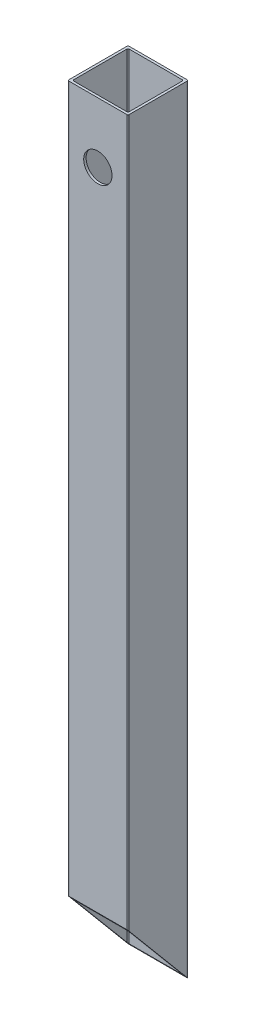
ISO-10303-21;
HEADER;
FILE_DESCRIPTION(('STEP AP214'),'2;1');
FILE_NAME('part.step','',(''),(''),'','','');
FILE_SCHEMA(('AUTOMOTIVE_DESIGN { 1 0 10303 214 1 1 1 1 }'));
ENDSEC;
DATA;
#1=APPLICATION_CONTEXT('core data for automotive mechanical design processes');
#2=APPLICATION_PROTOCOL_DEFINITION('international standard','automotive_design',2000,#1);
#3=PRODUCT_CONTEXT('',#1,'mechanical');
#4=PRODUCT('Part','Part','',(#3));
#5=PRODUCT_RELATED_PRODUCT_CATEGORY('part','',(#4));
#6=PRODUCT_DEFINITION_FORMATION('','',#4);
#7=PRODUCT_DEFINITION_CONTEXT('part definition',#1,'design');
#8=PRODUCT_DEFINITION('design','',#6,#7);
#9=PRODUCT_DEFINITION_SHAPE('','',#8);
#10=(LENGTH_UNIT() NAMED_UNIT(*) SI_UNIT(.MILLI.,.METRE.));
#11=(NAMED_UNIT(*) PLANE_ANGLE_UNIT() SI_UNIT($,.RADIAN.));
#12=(NAMED_UNIT(*) SI_UNIT($,.STERADIAN.) SOLID_ANGLE_UNIT());
#13=UNCERTAINTY_MEASURE_WITH_UNIT(LENGTH_MEASURE(1.E-05),#10,'distance_accuracy_value','');
#14=(GEOMETRIC_REPRESENTATION_CONTEXT(3) GLOBAL_UNCERTAINTY_ASSIGNED_CONTEXT((#13)) GLOBAL_UNIT_ASSIGNED_CONTEXT((#10,
#11,#12)) REPRESENTATION_CONTEXT('',''));
#15=CARTESIAN_POINT('',(0.,0.,0.));
#16=DIRECTION('',(0.,0.,1.));
#17=DIRECTION('',(1.,0.,0.));
#18=AXIS2_PLACEMENT_3D('',#15,#16,#17);
#19=CARTESIAN_POINT('',(2.,1500.,-2.));
#20=DIRECTION('',(0.,-1.,0.));
#21=DIRECTION('',(0.,0.,-1.));
#22=AXIS2_PLACEMENT_3D('',#19,#20,#21);
#23=CYLINDRICAL_SURFACE('',#22,2.);
#24=DIRECTION('',(0.,-1.,0.));
#25=VECTOR('',#24,1.);
#26=CARTESIAN_POINT('',(2.00000000000001,1500.,0.));
#27=LINE('',#26,#25);
#28=CARTESIAN_POINT('',(2.00000000000004,1371.,0.));
#29=VERTEX_POINT('',#28);
#30=CARTESIAN_POINT('',(2.00000000000002,200.,0.));
#31=VERTEX_POINT('',#30);
#32=EDGE_CURVE('E177',#29,#31,#27,.T.);
#33=ORIENTED_EDGE('',*,*,#32,.F.);
#34=CARTESIAN_POINT('',(2.,1371.,-2.));
#35=DIRECTION('',(0.,-1.,0.));
#36=DIRECTION('',(0.,0.,-1.));
#37=AXIS2_PLACEMENT_3D('',#34,#35,#36);
#38=CIRCLE('',#37,2.);
#39=CARTESIAN_POINT('',(0.,1371.,-2.00000000000001));
#40=VERTEX_POINT('',#39);
#41=EDGE_CURVE('E195',#29,#40,#38,.T.);
#42=ORIENTED_EDGE('',*,*,#41,.T.);
#43=DIRECTION('',(0.,-1.,0.));
#44=VECTOR('',#43,1.);
#45=CARTESIAN_POINT('',(0.,1500.,-2.00000000000001));
#46=LINE('',#45,#44);
#47=CARTESIAN_POINT('',(0.,197.616492814812,-2.00000000000001));
#48=VERTEX_POINT('',#47);
#49=EDGE_CURVE('E257',#40,#48,#46,.T.);
#50=ORIENTED_EDGE('',*,*,#49,.T.);
#51=CARTESIAN_POINT('',(2.,197.616492814812,-2.));
#52=DIRECTION('',(0.,0.642787609686541,-0.766044443118977));
#53=DIRECTION('',(0.,-0.766044443118977,-0.642787609686541));
#54=AXIS2_PLACEMENT_3D('',#51,#52,#53);
#55=ELLIPSE('',#54,3.11144765372082,2.);
#56=EDGE_CURVE('E238',#48,#31,#55,.T.);
#57=ORIENTED_EDGE('',*,*,#56,.T.);
#58=EDGE_LOOP('',(#33,#42,#50,#57));
#59=FACE_BOUND('',#58,.T.);
#60=ADVANCED_FACE('F33',(#59),#23,.T.);
#61=CARTESIAN_POINT('',(2.00000000000001,1500.,0.));
#62=DIRECTION('',(0.,0.,-1.));
#63=DIRECTION('',(-1.,0.,0.));
#64=AXIS2_PLACEMENT_3D('',#61,#62,#63);
#65=PLANE('',#64);
#66=CARTESIAN_POINT('',(50.,1271.,0.));
#67=DIRECTION('',(0.,0.,-1.));
#68=DIRECTION('',(-1.,0.,0.));
#69=AXIS2_PLACEMENT_3D('',#66,#67,#68);
#70=CIRCLE('',#69,23.4999999999999);
#71=CARTESIAN_POINT('',(26.5,1271.,0.));
#72=VERTEX_POINT('',#71);
#73=EDGE_CURVE('E183',#72,#72,#70,.T.);
#74=ORIENTED_EDGE('',*,*,#73,.T.);
#75=EDGE_LOOP('',(#74));
#76=FACE_BOUND('',#75,.T.);
#77=DIRECTION('',(0.,-1.,0.));
#78=VECTOR('',#77,1.);
#79=CARTESIAN_POINT('',(98.,1500.,0.));
#80=LINE('',#79,#78);
#81=CARTESIAN_POINT('',(98.,1371.,0.));
#82=VERTEX_POINT('',#81);
#83=CARTESIAN_POINT('',(98.,200.,0.));
#84=VERTEX_POINT('',#83);
#85=EDGE_CURVE('E175',#82,#84,#80,.T.);
#86=ORIENTED_EDGE('',*,*,#85,.F.);
#87=DIRECTION('',(-1.,0.,0.));
#88=VECTOR('',#87,1.);
#89=CARTESIAN_POINT('',(100.,1371.,0.));
#90=LINE('',#89,#88);
#91=EDGE_CURVE('E160',#82,#29,#90,.T.);
#92=ORIENTED_EDGE('',*,*,#91,.T.);
#93=ORIENTED_EDGE('',*,*,#32,.T.);
#94=DIRECTION('',(-1.,0.,0.));
#95=VECTOR('',#94,1.);
#96=CARTESIAN_POINT('',(100.,200.,0.));
#97=LINE('',#96,#95);
#98=EDGE_CURVE('E203',#84,#31,#97,.T.);
#99=ORIENTED_EDGE('',*,*,#98,.F.);
#100=EDGE_LOOP('',(#86,#92,#93,#99));
#101=FACE_BOUND('',#100,.T.);
#102=ADVANCED_FACE('F283',(#76,#101),#65,.F.);
#103=CARTESIAN_POINT('',(98.,1500.,-2.));
#104=DIRECTION('',(0.,-1.,0.));
#105=DIRECTION('',(0.,0.,-1.));
#106=AXIS2_PLACEMENT_3D('',#103,#104,#105);
#107=CYLINDRICAL_SURFACE('',#106,2.);
#108=DIRECTION('',(0.,-1.,0.));
#109=VECTOR('',#108,1.);
#110=CARTESIAN_POINT('',(100.,1500.,-2.00000000000001));
#111=LINE('',#110,#109);
#112=CARTESIAN_POINT('',(100.,1371.,-2.00000000000001));
#113=VERTEX_POINT('',#112);
#114=CARTESIAN_POINT('',(100.,197.616492814811,-2.00000000000006));
#115=VERTEX_POINT('',#114);
#116=EDGE_CURVE('E168',#113,#115,#111,.T.);
#117=ORIENTED_EDGE('',*,*,#116,.F.);
#118=CARTESIAN_POINT('',(98.,1371.,-2.));
#119=DIRECTION('',(0.,-1.,0.));
#120=DIRECTION('',(0.,0.,-1.));
#121=AXIS2_PLACEMENT_3D('',#118,#119,#120);
#122=CIRCLE('',#121,2.);
#123=EDGE_CURVE('E151',#113,#82,#122,.T.);
#124=ORIENTED_EDGE('',*,*,#123,.T.);
#125=ORIENTED_EDGE('',*,*,#85,.T.);
#126=CARTESIAN_POINT('',(98.,197.616492814812,-2.));
#127=DIRECTION('',(0.,0.642787609686541,-0.766044443118977));
#128=DIRECTION('',(0.,-0.766044443118977,-0.642787609686541));
#129=AXIS2_PLACEMENT_3D('',#126,#127,#128);
#130=ELLIPSE('',#129,3.11144765372082,2.);
#131=EDGE_CURVE('E235',#84,#115,#130,.T.);
#132=ORIENTED_EDGE('',*,*,#131,.T.);
#133=EDGE_LOOP('',(#117,#124,#125,#132));
#134=FACE_BOUND('',#133,.T.);
#135=ADVANCED_FACE('F354',(#134),#107,.T.);
#136=CARTESIAN_POINT('',(100.,1500.,-2.00000000000001));
#137=DIRECTION('',(-1.,0.,0.));
#138=DIRECTION('',(0.,0.,1.));
#139=AXIS2_PLACEMENT_3D('',#136,#137,#138);
#140=PLANE('',#139);
#141=DIRECTION('',(0.,-1.,0.));
#142=VECTOR('',#141,1.);
#143=CARTESIAN_POINT('',(100.,1500.,-98.));
#144=LINE('',#143,#142);
#145=CARTESIAN_POINT('',(100.,1371.,-98.));
#146=VERTEX_POINT('',#145);
#147=CARTESIAN_POINT('',(100.,83.2081479257676,-98.0000000000001));
#148=VERTEX_POINT('',#147);
#149=EDGE_CURVE('E166',#146,#148,#144,.T.);
#150=ORIENTED_EDGE('',*,*,#149,.F.);
#151=DIRECTION('',(0.,0.,-1.));
#152=VECTOR('',#151,1.);
#153=CARTESIAN_POINT('',(100.,1371.,0.));
#154=LINE('',#153,#152);
#155=EDGE_CURVE('E147',#113,#146,#154,.T.);
#156=ORIENTED_EDGE('',*,*,#155,.F.);
#157=ORIENTED_EDGE('',*,*,#116,.T.);
#158=DIRECTION('',(0.,-0.766044443118977,-0.642787609686541));
#159=VECTOR('',#158,1.);
#160=CARTESIAN_POINT('',(100.,200.,0.));
#161=LINE('',#160,#159);
#162=EDGE_CURVE('E200',#115,#148,#161,.T.);
#163=ORIENTED_EDGE('',*,*,#162,.T.);
#164=EDGE_LOOP('',(#150,#156,#157,#163));
#165=FACE_BOUND('',#164,.T.);
#166=ADVANCED_FACE('F358',(#165),#140,.F.);
#167=CARTESIAN_POINT('',(98.,1500.,-98.));
#168=DIRECTION('',(0.,-1.,0.));
#169=DIRECTION('',(0.,0.,-1.));
#170=AXIS2_PLACEMENT_3D('',#167,#168,#169);
#171=CYLINDRICAL_SURFACE('',#170,2.);
#172=DIRECTION('',(0.,-1.,0.));
#173=VECTOR('',#172,1.);
#174=CARTESIAN_POINT('',(98.,1500.,-100.));
#175=LINE('',#174,#173);
#176=CARTESIAN_POINT('',(98.,1371.,-100.));
#177=VERTEX_POINT('',#176);
#178=CARTESIAN_POINT('',(98.,80.8246407405793,-100.));
#179=VERTEX_POINT('',#178);
#180=EDGE_CURVE('E157',#177,#179,#175,.T.);
#181=ORIENTED_EDGE('',*,*,#180,.F.);
#182=CARTESIAN_POINT('',(98.,1371.,-98.));
#183=DIRECTION('',(0.,-1.,0.));
#184=DIRECTION('',(0.,0.,-1.));
#185=AXIS2_PLACEMENT_3D('',#182,#183,#184);
#186=CIRCLE('',#185,2.);
#187=EDGE_CURVE('E142',#177,#146,#186,.T.);
#188=ORIENTED_EDGE('',*,*,#187,.T.);
#189=ORIENTED_EDGE('',*,*,#149,.T.);
#190=CARTESIAN_POINT('',(98.,83.2081479257676,-98.));
#191=DIRECTION('',(0.,0.642787609686541,-0.766044443118977));
#192=DIRECTION('',(0.,-0.766044443118977,-0.642787609686541));
#193=AXIS2_PLACEMENT_3D('',#190,#191,#192);
#194=ELLIPSE('',#193,3.11144765372082,2.);
#195=EDGE_CURVE('E165',#148,#179,#194,.T.);
#196=ORIENTED_EDGE('',*,*,#195,.T.);
#197=EDGE_LOOP('',(#181,#188,#189,#196));
#198=FACE_BOUND('',#197,.T.);
#199=ADVANCED_FACE('F163',(#198),#171,.T.);
#200=CARTESIAN_POINT('',(2.00000000000001,1500.,-100.));
#201=DIRECTION('',(0.,0.,1.));
#202=DIRECTION('',(1.,0.,0.));
#203=AXIS2_PLACEMENT_3D('',#200,#201,#202);
#204=PLANE('',#203);
#205=CARTESIAN_POINT('',(50.,1271.,-100.));
#206=DIRECTION('',(0.,0.,-1.));
#207=DIRECTION('',(-1.,0.,0.));
#208=AXIS2_PLACEMENT_3D('',#205,#206,#207);
#209=CIRCLE('',#208,23.4999999999999);
#210=CARTESIAN_POINT('',(26.5,1271.,-100.));
#211=VERTEX_POINT('',#210);
#212=EDGE_CURVE('E190',#211,#211,#209,.T.);
#213=ORIENTED_EDGE('',*,*,#212,.F.);
#214=EDGE_LOOP('',(#213));
#215=FACE_BOUND('',#214,.T.);
#216=DIRECTION('',(0.,-1.,0.));
#217=VECTOR('',#216,1.);
#218=CARTESIAN_POINT('',(2.00000000000001,1500.,-100.));
#219=LINE('',#218,#217);
#220=CARTESIAN_POINT('',(2.00000000000003,1371.,-100.));
#221=VERTEX_POINT('',#220);
#222=CARTESIAN_POINT('',(2.00000000000001,80.8246407405793,-100.));
#223=VERTEX_POINT('',#222);
#224=EDGE_CURVE('E159',#221,#223,#219,.T.);
#225=ORIENTED_EDGE('',*,*,#224,.F.);
#226=DIRECTION('',(-1.,0.,0.));
#227=VECTOR('',#226,1.);
#228=CARTESIAN_POINT('',(100.,1371.,-100.));
#229=LINE('',#228,#227);
#230=EDGE_CURVE('E145',#177,#221,#229,.T.);
#231=ORIENTED_EDGE('',*,*,#230,.F.);
#232=ORIENTED_EDGE('',*,*,#180,.T.);
#233=DIRECTION('',(-1.,0.,0.));
#234=VECTOR('',#233,1.);
#235=CARTESIAN_POINT('',(2.00000000000001,80.8246407405793,-100.));
#236=LINE('',#235,#234);
#237=EDGE_CURVE('E232',#179,#223,#236,.T.);
#238=ORIENTED_EDGE('',*,*,#237,.T.);
#239=EDGE_LOOP('',(#225,#231,#232,#238));
#240=FACE_BOUND('',#239,.T.);
#241=ADVANCED_FACE('F155',(#215,#240),#204,.F.);
#242=CARTESIAN_POINT('',(2.,1500.,-98.));
#243=DIRECTION('',(0.,-1.,0.));
#244=DIRECTION('',(0.,0.,-1.));
#245=AXIS2_PLACEMENT_3D('',#242,#243,#244);
#246=CYLINDRICAL_SURFACE('',#245,2.);
#247=DIRECTION('',(0.,-1.,0.));
#248=VECTOR('',#247,1.);
#249=CARTESIAN_POINT('',(0.,1500.,-98.));
#250=LINE('',#249,#248);
#251=CARTESIAN_POINT('',(0.,1371.,-98.));
#252=VERTEX_POINT('',#251);
#253=CARTESIAN_POINT('',(0.,83.2081479257676,-98.0000000000002));
#254=VERTEX_POINT('',#253);
#255=EDGE_CURVE('E170',#252,#254,#250,.T.);
#256=ORIENTED_EDGE('',*,*,#255,.F.);
#257=CARTESIAN_POINT('',(2.,1371.,-98.));
#258=DIRECTION('',(0.,-1.,0.));
#259=DIRECTION('',(0.,0.,-1.));
#260=AXIS2_PLACEMENT_3D('',#257,#258,#259);
#261=CIRCLE('',#260,2.);
#262=EDGE_CURVE('E47',#252,#221,#261,.T.);
#263=ORIENTED_EDGE('',*,*,#262,.T.);
#264=ORIENTED_EDGE('',*,*,#224,.T.);
#265=CARTESIAN_POINT('',(2.,83.2081479257676,-98.));
#266=DIRECTION('',(0.,0.642787609686541,-0.766044443118977));
#267=DIRECTION('',(0.,-0.766044443118977,-0.642787609686541));
#268=AXIS2_PLACEMENT_3D('',#265,#266,#267);
#269=ELLIPSE('',#268,3.11144765372082,2.);
#270=EDGE_CURVE('E229',#223,#254,#269,.T.);
#271=ORIENTED_EDGE('',*,*,#270,.T.);
#272=EDGE_LOOP('',(#256,#263,#264,#271));
#273=FACE_BOUND('',#272,.T.);
#274=ADVANCED_FACE('F269',(#273),#246,.T.);
#275=CARTESIAN_POINT('',(0.,1500.,-2.00000000000001));
#276=DIRECTION('',(1.,0.,0.));
#277=DIRECTION('',(0.,0.,-1.));
#278=AXIS2_PLACEMENT_3D('',#275,#276,#277);
#279=PLANE('',#278);
#280=ORIENTED_EDGE('',*,*,#49,.F.);
#281=DIRECTION('',(0.,0.,-1.));
#282=VECTOR('',#281,1.);
#283=CARTESIAN_POINT('',(0.,1371.,0.));
#284=LINE('',#283,#282);
#285=EDGE_CURVE('E263',#40,#252,#284,.T.);
#286=ORIENTED_EDGE('',*,*,#285,.T.);
#287=ORIENTED_EDGE('',*,*,#255,.T.);
#288=DIRECTION('',(0.,-0.766044443118977,-0.642787609686541));
#289=VECTOR('',#288,1.);
#290=CARTESIAN_POINT('',(0.,200.,0.));
#291=LINE('',#290,#289);
#292=EDGE_CURVE('E187',#48,#254,#291,.T.);
#293=ORIENTED_EDGE('',*,*,#292,.F.);
#294=EDGE_LOOP('',(#280,#286,#287,#293));
#295=FACE_BOUND('',#294,.T.);
#296=ADVANCED_FACE('F262',(#295),#279,.F.);
#297=CARTESIAN_POINT('',(6.,1500.,-94.));
#298=DIRECTION('',(0.,-1.,0.));
#299=DIRECTION('',(0.,0.,-1.));
#300=AXIS2_PLACEMENT_3D('',#297,#298,#299);
#301=CYLINDRICAL_SURFACE('',#300,2.);
#302=CARTESIAN_POINT('',(6.,1371.,-94.));
#303=DIRECTION('',(0.,-1.,0.));
#304=DIRECTION('',(0.,0.,-1.));
#305=AXIS2_PLACEMENT_3D('',#302,#303,#304);
#306=CIRCLE('',#305,2.);
#307=CARTESIAN_POINT('',(4.,1371.,-94.));
#308=VERTEX_POINT('',#307);
#309=CARTESIAN_POINT('',(6.00000000000001,1371.,-96.));
#310=VERTEX_POINT('',#309);
#311=EDGE_CURVE('E54',#308,#310,#306,.T.);
#312=ORIENTED_EDGE('',*,*,#311,.F.);
#313=DIRECTION('',(0.,-1.,0.));
#314=VECTOR('',#313,1.);
#315=CARTESIAN_POINT('',(4.,1500.,-94.));
#316=LINE('',#315,#314);
#317=CARTESIAN_POINT('',(4.,87.9751622961448,-94.));
#318=VERTEX_POINT('',#317);
#319=EDGE_CURVE('E255',#308,#318,#316,.T.);
#320=ORIENTED_EDGE('',*,*,#319,.T.);
#321=CARTESIAN_POINT('',(6.,87.9751622961444,-94.));
#322=DIRECTION('',(0.,0.642787609686541,-0.766044443118977));
#323=DIRECTION('',(0.,-0.766044443118977,-0.642787609686541));
#324=AXIS2_PLACEMENT_3D('',#321,#322,#323);
#325=ELLIPSE('',#324,3.11144765372082,2.);
#326=CARTESIAN_POINT('',(6.00000000000001,85.5916551109561,-96.));
#327=VERTEX_POINT('',#326);
#328=EDGE_CURVE('E226',#327,#318,#325,.T.);
#329=ORIENTED_EDGE('',*,*,#328,.F.);
#330=DIRECTION('',(0.,-1.,0.));
#331=VECTOR('',#330,1.);
#332=CARTESIAN_POINT('',(6.00000000000001,1500.,-96.));
#333=LINE('',#332,#331);
#334=EDGE_CURVE('E241',#310,#327,#333,.T.);
#335=ORIENTED_EDGE('',*,*,#334,.F.);
#336=EDGE_LOOP('',(#312,#320,#329,#335));
#337=FACE_BOUND('',#336,.T.);
#338=ADVANCED_FACE('F305',(#337),#301,.F.);
#339=CARTESIAN_POINT('',(4.,1500.,-6.00000000000001));
#340=DIRECTION('',(1.,0.,0.));
#341=DIRECTION('',(0.,0.,-1.));
#342=AXIS2_PLACEMENT_3D('',#339,#340,#341);
#343=PLANE('',#342);
#344=DIRECTION('',(0.,0.,-1.));
#345=VECTOR('',#344,1.);
#346=CARTESIAN_POINT('',(4.,1371.,-6.00000000000001));
#347=LINE('',#346,#345);
#348=CARTESIAN_POINT('',(4.,1371.,-6.00000000000001));
#349=VERTEX_POINT('',#348);
#350=EDGE_CURVE('E271',#349,#308,#347,.T.);
#351=ORIENTED_EDGE('',*,*,#350,.F.);
#352=DIRECTION('',(0.,-1.,0.));
#353=VECTOR('',#352,1.);
#354=CARTESIAN_POINT('',(4.,1500.,-6.00000000000001));
#355=LINE('',#354,#353);
#356=CARTESIAN_POINT('',(4.,192.849478444435,-6.00000000000001));
#357=VERTEX_POINT('',#356);
#358=EDGE_CURVE('E253',#349,#357,#355,.T.);
#359=ORIENTED_EDGE('',*,*,#358,.T.);
#360=DIRECTION('',(0.,0.766044443118977,0.642787609686541));
#361=VECTOR('',#360,1.);
#362=CARTESIAN_POINT('',(4.,959.916892224466,637.645983990936));
#363=LINE('',#362,#361);
#364=EDGE_CURVE('E223',#318,#357,#363,.T.);
#365=ORIENTED_EDGE('',*,*,#364,.F.);
#366=ORIENTED_EDGE('',*,*,#319,.F.);
#367=EDGE_LOOP('',(#351,#359,#365,#366));
#368=FACE_BOUND('',#367,.T.);
#369=ADVANCED_FACE('F308',(#368),#343,.T.);
#370=CARTESIAN_POINT('',(6.,1500.,-6.));
#371=DIRECTION('',(0.,-1.,0.));
#372=DIRECTION('',(0.,0.,-1.));
#373=AXIS2_PLACEMENT_3D('',#370,#371,#372);
#374=CYLINDRICAL_SURFACE('',#373,2.);
#375=CARTESIAN_POINT('',(6.,1371.,-6.));
#376=DIRECTION('',(0.,-1.,0.));
#377=DIRECTION('',(0.,0.,-1.));
#378=AXIS2_PLACEMENT_3D('',#375,#376,#377);
#379=CIRCLE('',#378,2.);
#380=CARTESIAN_POINT('',(6.00000000000001,1371.,-4.));
#381=VERTEX_POINT('',#380);
#382=EDGE_CURVE('E297',#381,#349,#379,.T.);
#383=ORIENTED_EDGE('',*,*,#382,.F.);
#384=DIRECTION('',(0.,-1.,0.));
#385=VECTOR('',#384,1.);
#386=CARTESIAN_POINT('',(6.00000000000001,1500.,-4.));
#387=LINE('',#386,#385);
#388=CARTESIAN_POINT('',(6.00000000000001,195.232985629623,-4.));
#389=VERTEX_POINT('',#388);
#390=EDGE_CURVE('E251',#381,#389,#387,.T.);
#391=ORIENTED_EDGE('',*,*,#390,.T.);
#392=CARTESIAN_POINT('',(6.,192.849478444435,-6.));
#393=DIRECTION('',(0.,0.642787609686541,-0.766044443118977));
#394=DIRECTION('',(0.,-0.766044443118977,-0.642787609686541));
#395=AXIS2_PLACEMENT_3D('',#392,#393,#394);
#396=ELLIPSE('',#395,3.11144765372082,2.);
#397=EDGE_CURVE('E220',#357,#389,#396,.T.);
#398=ORIENTED_EDGE('',*,*,#397,.F.);
#399=ORIENTED_EDGE('',*,*,#358,.F.);
#400=EDGE_LOOP('',(#383,#391,#398,#399));
#401=FACE_BOUND('',#400,.T.);
#402=ADVANCED_FACE('F313',(#401),#374,.F.);
#403=CARTESIAN_POINT('',(6.00000000000001,1500.,-4.));
#404=DIRECTION('',(0.,0.,-1.));
#405=DIRECTION('',(-1.,0.,0.));
#406=AXIS2_PLACEMENT_3D('',#403,#404,#405);
#407=PLANE('',#406);
#408=DIRECTION('',(-1.,0.,0.));
#409=VECTOR('',#408,1.);
#410=CARTESIAN_POINT('',(6.00000000000001,1371.,-4.));
#411=LINE('',#410,#409);
#412=CARTESIAN_POINT('',(94.,1371.,-4.));
#413=VERTEX_POINT('',#412);
#414=EDGE_CURVE('E295',#413,#381,#411,.T.);
#415=ORIENTED_EDGE('',*,*,#414,.F.);
#416=DIRECTION('',(0.,-1.,0.));
#417=VECTOR('',#416,1.);
#418=CARTESIAN_POINT('',(94.,1500.,-4.));
#419=LINE('',#418,#417);
#420=CARTESIAN_POINT('',(94.,195.232985629623,-4.));
#421=VERTEX_POINT('',#420);
#422=EDGE_CURVE('E249',#413,#421,#419,.T.);
#423=ORIENTED_EDGE('',*,*,#422,.T.);
#424=DIRECTION('',(1.,0.,0.));
#425=VECTOR('',#424,1.);
#426=CARTESIAN_POINT('',(6.00000000000001,195.232985629623,-4.));
#427=LINE('',#426,#425);
#428=EDGE_CURVE('E217',#389,#421,#427,.T.);
#429=ORIENTED_EDGE('',*,*,#428,.F.);
#430=ORIENTED_EDGE('',*,*,#390,.F.);
#431=EDGE_LOOP('',(#415,#423,#429,#430));
#432=FACE_BOUND('',#431,.T.);
#433=CARTESIAN_POINT('',(50.,1271.,-4.));
#434=DIRECTION('',(0.,0.,-1.));
#435=DIRECTION('',(-1.,0.,0.));
#436=AXIS2_PLACEMENT_3D('',#433,#434,#435);
#437=CIRCLE('',#436,23.4999999999999);
#438=CARTESIAN_POINT('',(26.5,1271.,-4.));
#439=VERTEX_POINT('',#438);
#440=EDGE_CURVE('E182',#439,#439,#437,.T.);
#441=ORIENTED_EDGE('',*,*,#440,.F.);
#442=EDGE_LOOP('',(#441));
#443=FACE_BOUND('',#442,.T.);
#444=ADVANCED_FACE('F317',(#432,#443),#407,.T.);
#445=CARTESIAN_POINT('',(94.,1500.,-6.));
#446=DIRECTION('',(0.,-1.,0.));
#447=DIRECTION('',(0.,0.,-1.));
#448=AXIS2_PLACEMENT_3D('',#445,#446,#447);
#449=CYLINDRICAL_SURFACE('',#448,2.);
#450=CARTESIAN_POINT('',(94.,1371.,-6.));
#451=DIRECTION('',(0.,-1.,0.));
#452=DIRECTION('',(0.,0.,-1.));
#453=AXIS2_PLACEMENT_3D('',#450,#451,#452);
#454=CIRCLE('',#453,2.);
#455=CARTESIAN_POINT('',(96.,1371.,-5.99999999999989));
#456=VERTEX_POINT('',#455);
#457=EDGE_CURVE('E293',#456,#413,#454,.T.);
#458=ORIENTED_EDGE('',*,*,#457,.F.);
#459=DIRECTION('',(0.,-1.,0.));
#460=VECTOR('',#459,1.);
#461=CARTESIAN_POINT('',(96.,1500.,-6.00000000000001));
#462=LINE('',#461,#460);
#463=CARTESIAN_POINT('',(96.,192.849478444435,-5.99999999999989));
#464=VERTEX_POINT('',#463);
#465=EDGE_CURVE('E247',#456,#464,#462,.T.);
#466=ORIENTED_EDGE('',*,*,#465,.T.);
#467=CARTESIAN_POINT('',(94.,192.849478444435,-6.));
#468=DIRECTION('',(0.,0.642787609686541,-0.766044443118977));
#469=DIRECTION('',(0.,-0.766044443118977,-0.642787609686541));
#470=AXIS2_PLACEMENT_3D('',#467,#468,#469);
#471=ELLIPSE('',#470,3.11144765372082,2.);
#472=EDGE_CURVE('E214',#421,#464,#471,.T.);
#473=ORIENTED_EDGE('',*,*,#472,.F.);
#474=ORIENTED_EDGE('',*,*,#422,.F.);
#475=EDGE_LOOP('',(#458,#466,#473,#474));
#476=FACE_BOUND('',#475,.T.);
#477=ADVANCED_FACE('F324',(#476),#449,.F.);
#478=CARTESIAN_POINT('',(96.,1500.,-6.00000000000001));
#479=DIRECTION('',(-1.,0.,0.));
#480=DIRECTION('',(0.,0.,1.));
#481=AXIS2_PLACEMENT_3D('',#478,#479,#480);
#482=PLANE('',#481);
#483=DIRECTION('',(0.,0.,1.));
#484=VECTOR('',#483,1.);
#485=CARTESIAN_POINT('',(96.,1371.,-6.00000000000001));
#486=LINE('',#485,#484);
#487=CARTESIAN_POINT('',(96.,1371.,-94.));
#488=VERTEX_POINT('',#487);
#489=EDGE_CURVE('E291',#488,#456,#486,.T.);
#490=ORIENTED_EDGE('',*,*,#489,.F.);
#491=DIRECTION('',(0.,-1.,0.));
#492=VECTOR('',#491,1.);
#493=CARTESIAN_POINT('',(96.,1500.,-94.));
#494=LINE('',#493,#492);
#495=CARTESIAN_POINT('',(96.,87.9751622961444,-94.));
#496=VERTEX_POINT('',#495);
#497=EDGE_CURVE('E245',#488,#496,#494,.T.);
#498=ORIENTED_EDGE('',*,*,#497,.T.);
#499=DIRECTION('',(0.,-0.766044443118977,-0.642787609686541));
#500=VECTOR('',#499,1.);
#501=CARTESIAN_POINT('',(96.,959.916892224466,637.645983990936));
#502=LINE('',#501,#500);
#503=EDGE_CURVE('E211',#464,#496,#502,.T.);
#504=ORIENTED_EDGE('',*,*,#503,.F.);
#505=ORIENTED_EDGE('',*,*,#465,.F.);
#506=EDGE_LOOP('',(#490,#498,#504,#505));
#507=FACE_BOUND('',#506,.T.);
#508=ADVANCED_FACE('F328',(#507),#482,.T.);
#509=CARTESIAN_POINT('',(94.,1500.,-94.));
#510=DIRECTION('',(0.,-1.,0.));
#511=DIRECTION('',(0.,0.,-1.));
#512=AXIS2_PLACEMENT_3D('',#509,#510,#511);
#513=CYLINDRICAL_SURFACE('',#512,2.);
#514=CARTESIAN_POINT('',(94.,1371.,-94.));
#515=DIRECTION('',(0.,-1.,0.));
#516=DIRECTION('',(0.,0.,-1.));
#517=AXIS2_PLACEMENT_3D('',#514,#515,#516);
#518=CIRCLE('',#517,2.);
#519=CARTESIAN_POINT('',(94.,1371.,-96.));
#520=VERTEX_POINT('',#519);
#521=EDGE_CURVE('E288',#520,#488,#518,.T.);
#522=ORIENTED_EDGE('',*,*,#521,.F.);
#523=DIRECTION('',(0.,-1.,0.));
#524=VECTOR('',#523,1.);
#525=CARTESIAN_POINT('',(94.,1500.,-96.));
#526=LINE('',#525,#524);
#527=CARTESIAN_POINT('',(94.,85.5916551109561,-96.));
#528=VERTEX_POINT('',#527);
#529=EDGE_CURVE('E243',#520,#528,#526,.T.);
#530=ORIENTED_EDGE('',*,*,#529,.T.);
#531=CARTESIAN_POINT('',(94.,87.9751622961444,-94.));
#532=DIRECTION('',(0.,0.642787609686541,-0.766044443118977));
#533=DIRECTION('',(0.,-0.766044443118977,-0.642787609686541));
#534=AXIS2_PLACEMENT_3D('',#531,#532,#533);
#535=ELLIPSE('',#534,3.11144765372082,2.);
#536=EDGE_CURVE('E208',#496,#528,#535,.T.);
#537=ORIENTED_EDGE('',*,*,#536,.F.);
#538=ORIENTED_EDGE('',*,*,#497,.F.);
#539=EDGE_LOOP('',(#522,#530,#537,#538));
#540=FACE_BOUND('',#539,.T.);
#541=ADVANCED_FACE('F334',(#540),#513,.F.);
#542=CARTESIAN_POINT('',(6.00000000000001,1500.,-96.));
#543=DIRECTION('',(0.,0.,1.));
#544=DIRECTION('',(1.,0.,0.));
#545=AXIS2_PLACEMENT_3D('',#542,#543,#544);
#546=PLANE('',#545);
#547=DIRECTION('',(1.,0.,0.));
#548=VECTOR('',#547,1.);
#549=CARTESIAN_POINT('',(6.00000000000001,1371.,-96.));
#550=LINE('',#549,#548);
#551=EDGE_CURVE('E11',#310,#520,#550,.T.);
#552=ORIENTED_EDGE('',*,*,#551,.F.);
#553=ORIENTED_EDGE('',*,*,#334,.T.);
#554=DIRECTION('',(-1.,0.,0.));
#555=VECTOR('',#554,1.);
#556=CARTESIAN_POINT('',(6.00000000000001,85.5916551109561,-96.));
#557=LINE('',#556,#555);
#558=EDGE_CURVE('E40',#528,#327,#557,.T.);
#559=ORIENTED_EDGE('',*,*,#558,.F.);
#560=ORIENTED_EDGE('',*,*,#529,.F.);
#561=EDGE_LOOP('',(#552,#553,#559,#560));
#562=FACE_BOUND('',#561,.T.);
#563=CARTESIAN_POINT('',(50.,1271.,-96.));
#564=DIRECTION('',(0.,0.,1.));
#565=DIRECTION('',(1.,0.,0.));
#566=AXIS2_PLACEMENT_3D('',#563,#564,#565);
#567=CIRCLE('',#566,23.4999999999999);
#568=CARTESIAN_POINT('',(73.4999999999999,1271.,-96.));
#569=VERTEX_POINT('',#568);
#570=EDGE_CURVE('E180',#569,#569,#567,.T.);
#571=ORIENTED_EDGE('',*,*,#570,.F.);
#572=EDGE_LOOP('',(#571));
#573=FACE_BOUND('',#572,.T.);
#574=ADVANCED_FACE('F337',(#562,#573),#546,.T.);
#575=CARTESIAN_POINT('',(100.,200.,0.));
#576=DIRECTION('',(0.,0.642787609686541,-0.766044443118977));
#577=DIRECTION('',(0.,0.766044443118977,0.642787609686541));
#578=AXIS2_PLACEMENT_3D('',#575,#576,#577);
#579=PLANE('',#578);
#580=ORIENTED_EDGE('',*,*,#328,.T.);
#581=ORIENTED_EDGE('',*,*,#364,.T.);
#582=ORIENTED_EDGE('',*,*,#397,.T.);
#583=ORIENTED_EDGE('',*,*,#428,.T.);
#584=ORIENTED_EDGE('',*,*,#472,.T.);
#585=ORIENTED_EDGE('',*,*,#503,.T.);
#586=ORIENTED_EDGE('',*,*,#536,.T.);
#587=ORIENTED_EDGE('',*,*,#558,.T.);
#588=EDGE_LOOP('',(#580,#581,#582,#583,#584,#585,#586,#587));
#589=FACE_BOUND('',#588,.T.);
#590=ORIENTED_EDGE('',*,*,#292,.T.);
#591=ORIENTED_EDGE('',*,*,#270,.F.);
#592=ORIENTED_EDGE('',*,*,#237,.F.);
#593=ORIENTED_EDGE('',*,*,#195,.F.);
#594=ORIENTED_EDGE('',*,*,#162,.F.);
#595=ORIENTED_EDGE('',*,*,#131,.F.);
#596=ORIENTED_EDGE('',*,*,#98,.T.);
#597=ORIENTED_EDGE('',*,*,#56,.F.);
#598=EDGE_LOOP('',(#590,#591,#592,#593,#594,#595,#596,#597));
#599=FACE_BOUND('',#598,.T.);
#600=ADVANCED_FACE('F268',(#589,#599),#579,.F.);
#601=CARTESIAN_POINT('',(50.,1271.,0.));
#602=DIRECTION('',(0.,0.,-1.));
#603=DIRECTION('',(-1.,0.,0.));
#604=AXIS2_PLACEMENT_3D('',#601,#602,#603);
#605=CYLINDRICAL_SURFACE('',#604,23.4999999999999);
#606=ORIENTED_EDGE('',*,*,#570,.T.);
#607=EDGE_LOOP('',(#606));
#608=FACE_BOUND('',#607,.T.);
#609=ORIENTED_EDGE('',*,*,#212,.T.);
#610=EDGE_LOOP('',(#609));
#611=FACE_BOUND('',#610,.T.);
#612=ADVANCED_FACE('F346',(#608,#611),#605,.F.);
#613=ORIENTED_EDGE('',*,*,#440,.T.);
#614=EDGE_LOOP('',(#613));
#615=FACE_BOUND('',#614,.T.);
#616=ORIENTED_EDGE('',*,*,#73,.F.);
#617=EDGE_LOOP('',(#616));
#618=FACE_BOUND('',#617,.T.);
#619=ADVANCED_FACE('F408',(#615,#618),#605,.F.);
#620=CARTESIAN_POINT('',(100.,1371.,0.));
#621=DIRECTION('',(0.,-1.,0.));
#622=DIRECTION('',(0.,0.,-1.));
#623=AXIS2_PLACEMENT_3D('',#620,#621,#622);
#624=PLANE('',#623);
#625=ORIENTED_EDGE('',*,*,#311,.T.);
#626=ORIENTED_EDGE('',*,*,#551,.T.);
#627=ORIENTED_EDGE('',*,*,#521,.T.);
#628=ORIENTED_EDGE('',*,*,#489,.T.);
#629=ORIENTED_EDGE('',*,*,#457,.T.);
#630=ORIENTED_EDGE('',*,*,#414,.T.);
#631=ORIENTED_EDGE('',*,*,#382,.T.);
#632=ORIENTED_EDGE('',*,*,#350,.T.);
#633=EDGE_LOOP('',(#625,#626,#627,#628,#629,#630,#631,#632));
#634=FACE_BOUND('',#633,.T.);
#635=ORIENTED_EDGE('',*,*,#91,.F.);
#636=ORIENTED_EDGE('',*,*,#123,.F.);
#637=ORIENTED_EDGE('',*,*,#155,.T.);
#638=ORIENTED_EDGE('',*,*,#187,.F.);
#639=ORIENTED_EDGE('',*,*,#230,.T.);
#640=ORIENTED_EDGE('',*,*,#262,.F.);
#641=ORIENTED_EDGE('',*,*,#285,.F.);
#642=ORIENTED_EDGE('',*,*,#41,.F.);
#643=EDGE_LOOP('',(#635,#636,#637,#638,#639,#640,#641,#642));
#644=FACE_BOUND('',#643,.T.);
#645=ADVANCED_FACE('F144',(#634,#644),#624,.F.);
#646=CLOSED_SHELL('',(#60,#102,#135,#166,#199,#241,#274,#296,#338,#369,#402,#444,#477,#508,#541,
#574,#600,#612,#619,#645));
#647=MANIFOLD_SOLID_BREP('B2',#646);
#648=ADVANCED_BREP_SHAPE_REPRESENTATION('',(#18,#647),#14);
#649=SHAPE_DEFINITION_REPRESENTATION(#9,#648);
ENDSEC;
END-ISO-10303-21;
